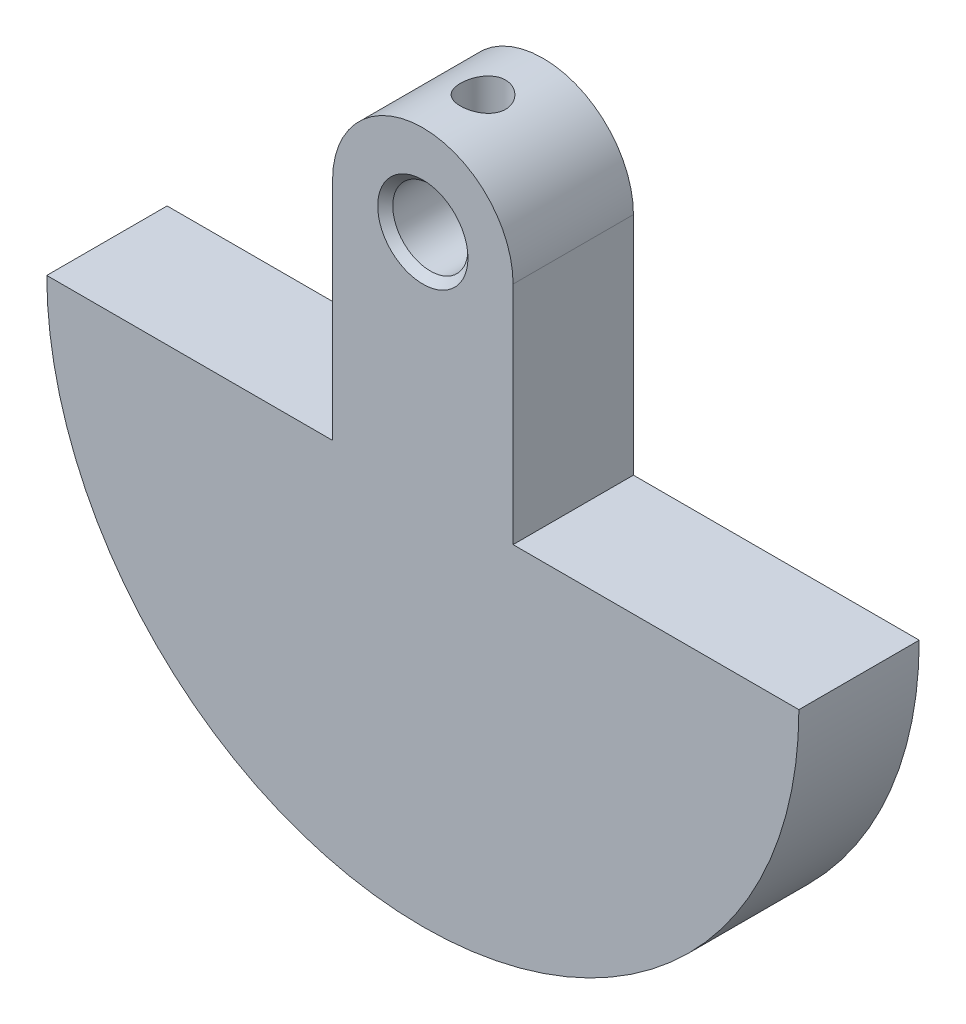
ISO-10303-21;
HEADER;
FILE_DESCRIPTION(('STEP AP214'),'2;1');
FILE_NAME('part.step','',(''),(''),'','','');
FILE_SCHEMA(('AUTOMOTIVE_DESIGN { 1 0 10303 214 1 1 1 1 }'));
ENDSEC;
DATA;
#1=APPLICATION_CONTEXT('core data for automotive mechanical design processes');
#2=APPLICATION_PROTOCOL_DEFINITION('international standard','automotive_design',2000,#1);
#3=PRODUCT_CONTEXT('',#1,'mechanical');
#4=PRODUCT('Part','Part','',(#3));
#5=PRODUCT_RELATED_PRODUCT_CATEGORY('part','',(#4));
#6=PRODUCT_DEFINITION_FORMATION('','',#4);
#7=PRODUCT_DEFINITION_CONTEXT('part definition',#1,'design');
#8=PRODUCT_DEFINITION('design','',#6,#7);
#9=PRODUCT_DEFINITION_SHAPE('','',#8);
#10=(LENGTH_UNIT() NAMED_UNIT(*) SI_UNIT(.MILLI.,.METRE.));
#11=(NAMED_UNIT(*) PLANE_ANGLE_UNIT() SI_UNIT($,.RADIAN.));
#12=(NAMED_UNIT(*) SI_UNIT($,.STERADIAN.) SOLID_ANGLE_UNIT());
#13=UNCERTAINTY_MEASURE_WITH_UNIT(LENGTH_MEASURE(1.E-05),#10,'distance_accuracy_value','');
#14=(GEOMETRIC_REPRESENTATION_CONTEXT(3) GLOBAL_UNCERTAINTY_ASSIGNED_CONTEXT((#13)) GLOBAL_UNIT_ASSIGNED_CONTEXT((#10,
#11,#12)) REPRESENTATION_CONTEXT('',''));
#15=CARTESIAN_POINT('',(0.,0.,0.));
#16=DIRECTION('',(0.,0.,1.));
#17=DIRECTION('',(1.,0.,0.));
#18=AXIS2_PLACEMENT_3D('',#15,#16,#17);
#19=CARTESIAN_POINT('',(0.,15.,8.));
#20=DIRECTION('',(0.,0.,1.));
#21=DIRECTION('',(1.,0.,0.));
#22=AXIS2_PLACEMENT_3D('',#19,#20,#21);
#23=PLANE('',#22);
#24=CARTESIAN_POINT('',(0.,15.,8.));
#25=DIRECTION('',(0.,0.,1.));
#26=DIRECTION('',(1.,0.,0.));
#27=AXIS2_PLACEMENT_3D('',#24,#25,#26);
#28=CIRCLE('',#27,3.);
#29=CARTESIAN_POINT('',(3.,15.,8.));
#30=VERTEX_POINT('',#29);
#31=EDGE_CURVE('E11',#30,#30,#28,.F.);
#32=ORIENTED_EDGE('',*,*,#31,.T.);
#33=EDGE_LOOP('',(#32));
#34=FACE_BOUND('',#33,.T.);
#35=CARTESIAN_POINT('',(0.,15.,8.));
#36=DIRECTION('',(0.,0.,1.));
#37=DIRECTION('',(1.,0.,0.));
#38=AXIS2_PLACEMENT_3D('',#35,#36,#37);
#39=CIRCLE('',#38,6.);
#40=CARTESIAN_POINT('',(6.,15.,8.));
#41=VERTEX_POINT('',#40);
#42=CARTESIAN_POINT('',(-6.,15.,8.));
#43=VERTEX_POINT('',#42);
#44=EDGE_CURVE('E138',#41,#43,#39,.T.);
#45=ORIENTED_EDGE('',*,*,#44,.T.);
#46=DIRECTION('',(0.,-1.,0.));
#47=VECTOR('',#46,1.);
#48=CARTESIAN_POINT('',(-6.,15.,8.));
#49=LINE('',#48,#47);
#50=CARTESIAN_POINT('',(-6.,0.,8.));
#51=VERTEX_POINT('',#50);
#52=EDGE_CURVE('E97',#43,#51,#49,.T.);
#53=ORIENTED_EDGE('',*,*,#52,.T.);
#54=DIRECTION('',(-1.,0.,0.));
#55=VECTOR('',#54,1.);
#56=CARTESIAN_POINT('',(-6.,0.,8.));
#57=LINE('',#56,#55);
#58=CARTESIAN_POINT('',(-25.,0.,8.));
#59=VERTEX_POINT('',#58);
#60=EDGE_CURVE('E109',#51,#59,#57,.T.);
#61=ORIENTED_EDGE('',*,*,#60,.T.);
#62=CARTESIAN_POINT('',(0.,0.,8.));
#63=DIRECTION('',(0.,0.,1.));
#64=DIRECTION('',(1.,0.,0.));
#65=AXIS2_PLACEMENT_3D('',#62,#63,#64);
#66=CIRCLE('',#65,25.);
#67=CARTESIAN_POINT('',(25.,0.,8.));
#68=VERTEX_POINT('',#67);
#69=EDGE_CURVE('E104',#59,#68,#66,.T.);
#70=ORIENTED_EDGE('',*,*,#69,.T.);
#71=DIRECTION('',(-1.,0.,0.));
#72=VECTOR('',#71,1.);
#73=CARTESIAN_POINT('',(6.,0.,8.));
#74=LINE('',#73,#72);
#75=CARTESIAN_POINT('',(6.,0.,8.));
#76=VERTEX_POINT('',#75);
#77=EDGE_CURVE('E107',#68,#76,#74,.T.);
#78=ORIENTED_EDGE('',*,*,#77,.T.);
#79=DIRECTION('',(0.,1.,0.));
#80=VECTOR('',#79,1.);
#81=CARTESIAN_POINT('',(6.,15.,8.));
#82=LINE('',#81,#80);
#83=EDGE_CURVE('E59',#76,#41,#82,.T.);
#84=ORIENTED_EDGE('',*,*,#83,.T.);
#85=EDGE_LOOP('',(#45,#53,#61,#70,#78,#84));
#86=FACE_BOUND('',#85,.T.);
#87=ADVANCED_FACE('F35',(#34,#86),#23,.T.);
#88=CARTESIAN_POINT('',(0.,15.,0.));
#89=DIRECTION('',(0.,0.,1.));
#90=DIRECTION('',(1.,0.,0.));
#91=AXIS2_PLACEMENT_3D('',#88,#89,#90);
#92=PLANE('',#91);
#93=CARTESIAN_POINT('',(0.,15.,0.));
#94=DIRECTION('',(0.,0.,1.));
#95=DIRECTION('',(1.,0.,0.));
#96=AXIS2_PLACEMENT_3D('',#93,#94,#95);
#97=CIRCLE('',#96,6.);
#98=CARTESIAN_POINT('',(6.,15.,0.));
#99=VERTEX_POINT('',#98);
#100=CARTESIAN_POINT('',(-6.,15.,0.));
#101=VERTEX_POINT('',#100);
#102=EDGE_CURVE('E127',#99,#101,#97,.T.);
#103=ORIENTED_EDGE('',*,*,#102,.F.);
#104=DIRECTION('',(0.,1.,0.));
#105=VECTOR('',#104,1.);
#106=CARTESIAN_POINT('',(6.,15.,0.));
#107=LINE('',#106,#105);
#108=CARTESIAN_POINT('',(6.,0.,0.));
#109=VERTEX_POINT('',#108);
#110=EDGE_CURVE('E88',#109,#99,#107,.T.);
#111=ORIENTED_EDGE('',*,*,#110,.F.);
#112=DIRECTION('',(-1.,0.,0.));
#113=VECTOR('',#112,1.);
#114=CARTESIAN_POINT('',(6.,0.,0.));
#115=LINE('',#114,#113);
#116=CARTESIAN_POINT('',(25.,0.,0.));
#117=VERTEX_POINT('',#116);
#118=EDGE_CURVE('E82',#117,#109,#115,.T.);
#119=ORIENTED_EDGE('',*,*,#118,.F.);
#120=CARTESIAN_POINT('',(0.,0.,0.));
#121=DIRECTION('',(0.,0.,1.));
#122=DIRECTION('',(1.,0.,0.));
#123=AXIS2_PLACEMENT_3D('',#120,#121,#122);
#124=CIRCLE('',#123,25.);
#125=CARTESIAN_POINT('',(-25.,0.,0.));
#126=VERTEX_POINT('',#125);
#127=EDGE_CURVE('E117',#126,#117,#124,.T.);
#128=ORIENTED_EDGE('',*,*,#127,.F.);
#129=DIRECTION('',(-1.,0.,0.));
#130=VECTOR('',#129,1.);
#131=CARTESIAN_POINT('',(-6.,0.,0.));
#132=LINE('',#131,#130);
#133=CARTESIAN_POINT('',(-6.,0.,0.));
#134=VERTEX_POINT('',#133);
#135=EDGE_CURVE('E133',#134,#126,#132,.T.);
#136=ORIENTED_EDGE('',*,*,#135,.F.);
#137=DIRECTION('',(0.,-1.,0.));
#138=VECTOR('',#137,1.);
#139=CARTESIAN_POINT('',(-6.,15.,0.));
#140=LINE('',#139,#138);
#141=EDGE_CURVE('E130',#101,#134,#140,.T.);
#142=ORIENTED_EDGE('',*,*,#141,.F.);
#143=EDGE_LOOP('',(#103,#111,#119,#128,#136,#142));
#144=FACE_BOUND('',#143,.T.);
#145=CARTESIAN_POINT('',(0.,15.,0.));
#146=DIRECTION('',(0.,0.,1.));
#147=DIRECTION('',(1.,0.,0.));
#148=AXIS2_PLACEMENT_3D('',#145,#146,#147);
#149=CIRCLE('',#148,2.5);
#150=CARTESIAN_POINT('',(2.5,15.,0.));
#151=VERTEX_POINT('',#150);
#152=EDGE_CURVE('E131',#151,#151,#149,.T.);
#153=ORIENTED_EDGE('',*,*,#152,.T.);
#154=EDGE_LOOP('',(#153));
#155=FACE_BOUND('',#154,.T.);
#156=ADVANCED_FACE('F165',(#144,#155),#92,.F.);
#157=CARTESIAN_POINT('',(0.,15.,8.));
#158=DIRECTION('',(0.,0.,-1.));
#159=DIRECTION('',(-1.,0.,0.));
#160=AXIS2_PLACEMENT_3D('',#157,#158,#159);
#161=CYLINDRICAL_SURFACE('',#160,6.);
#162=CARTESIAN_POINT('',(0.,21.,5.5));
#163=CARTESIAN_POINT('',(-0.0828760886697311,20.9999985986801,5.49999767426184));
#164=CARTESIAN_POINT('',(-0.165778157830763,20.9982657813183,5.49310844922621));
#165=CARTESIAN_POINT('',(-0.329206323770533,20.9915211382989,5.465774848693));
#166=CARTESIAN_POINT('',(-0.409731046870739,20.9865074541997,5.44532279046215));
#167=CARTESIAN_POINT('',(-0.566020872182577,20.9737562633204,5.39156074653791));
#168=CARTESIAN_POINT('',(-0.641791563430003,20.9660220284209,5.35826620128472));
#169=CARTESIAN_POINT('',(-0.786672131904427,20.9486534380759,5.27981860995517));
#170=CARTESIAN_POINT('',(-0.855781784348759,20.9390190185405,5.23466516388106));
#171=CARTESIAN_POINT('',(-0.98680192730092,20.918674135918,5.13279921034579));
#172=CARTESIAN_POINT('',(-1.04855569006107,20.9079470714853,5.07588842504082));
#173=CARTESIAN_POINT('',(-1.1617489272033,20.8867362011753,4.95254779509108));
#174=CARTESIAN_POINT('',(-1.21318723694913,20.8762524228835,4.8861168770535));
#175=CARTESIAN_POINT('',(-1.30502654279903,20.8565477569971,4.74440477326256));
#176=CARTESIAN_POINT('',(-1.34525221592536,20.847347944706,4.6690067691896));
#177=CARTESIAN_POINT('',(-1.41239690855053,20.8314949481222,4.51225158834164));
#178=CARTESIAN_POINT('',(-1.43931805543933,20.8248413567279,4.43089536667424));
#179=CARTESIAN_POINT('',(-1.47855483680429,20.8150047671755,4.26625650179753));
#180=CARTESIAN_POINT('',(-1.49115226833334,20.8117549107543,4.1830451039502));
#181=CARTESIAN_POINT('',(-1.50226177506785,20.8088936253774,4.01563143098602));
#182=CARTESIAN_POINT('',(-1.50077614181798,20.8092816044864,3.93142931930139));
#183=CARTESIAN_POINT('',(-1.48398652463928,20.8135920549662,3.76658419225552));
#184=CARTESIAN_POINT('',(-1.46901834019052,20.8174286300188,3.6859043785349));
#185=CARTESIAN_POINT('',(-1.42622418690311,20.8280670967648,3.52823894908871));
#186=CARTESIAN_POINT('',(-1.39839730206942,20.834869199707,3.45125359697102));
#187=CARTESIAN_POINT('',(-1.33038947793715,20.8507511390419,3.30226198374793));
#188=CARTESIAN_POINT('',(-1.29008666723291,20.8598532746942,3.23031382821045));
#189=CARTESIAN_POINT('',(-1.19835627601495,20.8792971084639,3.09408129024316));
#190=CARTESIAN_POINT('',(-1.14692674880884,20.8896390233474,3.02979825193274));
#191=CARTESIAN_POINT('',(-1.03266342468122,20.9107588053978,2.9087963843056));
#192=CARTESIAN_POINT('',(-0.969546258165859,20.9215406947797,2.85234550993865));
#193=CARTESIAN_POINT('',(-0.834611917503699,20.9420596557879,2.7507787575361));
#194=CARTESIAN_POINT('',(-0.762794477707943,20.9517966954942,2.70566322573643));
#195=CARTESIAN_POINT('',(-0.612115888681391,20.9691773209418,2.62794941377561));
#196=CARTESIAN_POINT('',(-0.533231393208623,20.9768136012773,2.59539465974557));
#197=CARTESIAN_POINT('',(-0.370876008142883,20.9890791699142,2.54408269429043));
#198=CARTESIAN_POINT('',(-0.287405999150485,20.9937090333928,2.52532284358186));
#199=CARTESIAN_POINT('',(-0.120539970390027,20.9993549927137,2.50254243444116));
#200=CARTESIAN_POINT('',(-0.0371967199882101,21.0004605350828,2.4981569739247));
#201=CARTESIAN_POINT('',(0.129032874801508,20.9991880481445,2.50324900205549));
#202=CARTESIAN_POINT('',(0.211919259644595,20.9968103324185,2.51272524279913));
#203=CARTESIAN_POINT('',(0.373614268776492,20.9888958112736,2.54497090839138));
#204=CARTESIAN_POINT('',(0.452465118968754,20.9834063418581,2.56754126347699));
#205=CARTESIAN_POINT('',(0.605257292452511,20.9698870663413,2.62510708402845));
#206=CARTESIAN_POINT('',(0.679198119032635,20.9618570036989,2.66010380431317));
#207=CARTESIAN_POINT('',(0.821523134429847,20.9439330792631,2.74223612887473));
#208=CARTESIAN_POINT('',(0.88978544183583,20.9340086736693,2.78957611239676));
#209=CARTESIAN_POINT('',(1.01752661364325,20.9134450918742,2.89478990879697));
#210=CARTESIAN_POINT('',(1.07700395897301,20.9028057925171,2.95266553961691));
#211=CARTESIAN_POINT('',(1.18699056807273,20.8816895696077,3.07900196084446));
#212=CARTESIAN_POINT('',(1.23724386762203,20.8712230418728,3.14768770300242));
#213=CARTESIAN_POINT('',(1.3255107590127,20.8519287837724,3.29273263446572));
#214=CARTESIAN_POINT('',(1.36352489415794,20.8431009806703,3.36909148295975));
#215=CARTESIAN_POINT('',(1.42595142060929,20.8281809473467,3.52690572241308));
#216=CARTESIAN_POINT('',(1.45044439665406,20.8220725529191,3.60832762834401));
#217=CARTESIAN_POINT('',(1.48534565995378,20.8132674409018,3.77430963788911));
#218=CARTESIAN_POINT('',(1.49575702747866,20.8105699771994,3.85886905103249));
#219=CARTESIAN_POINT('',(1.50203859033399,20.8089490120396,4.0261210238552));
#220=CARTESIAN_POINT('',(1.49831789778012,20.8099193272826,4.10879743512473));
#221=CARTESIAN_POINT('',(1.47737727831287,20.8152790900784,4.27230388866798));
#222=CARTESIAN_POINT('',(1.46015762268677,20.8196684689186,4.35313396801365));
#223=CARTESIAN_POINT('',(1.41293131944279,20.8313126068272,4.51020845906541));
#224=CARTESIAN_POINT('',(1.38300140468038,20.8385501523631,4.58647730524021));
#225=CARTESIAN_POINT('',(1.31126491360507,20.8550775572483,4.73296538271369));
#226=CARTESIAN_POINT('',(1.26945669003419,20.8643677012077,4.80318377318692));
#227=CARTESIAN_POINT('',(1.17386774863714,20.8842563426351,4.93755462900202));
#228=CARTESIAN_POINT('',(1.11980316291225,20.8948826483176,5.00150107342396));
#229=CARTESIAN_POINT('',(1.00178937118974,20.9160802724629,5.11954704479541));
#230=CARTESIAN_POINT('',(0.937837821261145,20.9266515772706,5.17364423011297));
#231=CARTESIAN_POINT('',(0.80046758670259,20.9467765564766,5.27141130856461));
#232=CARTESIAN_POINT('',(0.726898422316386,20.9563083336587,5.31487461367158));
#233=CARTESIAN_POINT('',(0.573266059510476,20.9730492497512,5.38874746294053));
#234=CARTESIAN_POINT('',(0.493207563436739,20.9802600519978,5.41916636064854));
#235=CARTESIAN_POINT('',(0.344410253243472,20.9904805956554,5.46157183032965));
#236=CARTESIAN_POINT('',(0.276380170908068,20.9940258505269,5.47595124305343));
#237=CARTESIAN_POINT('',(0.138906071536283,20.9987860523195,5.49516594362194));
#238=CARTESIAN_POINT('',(0.0694621612426162,21.0000011745089,5.5000019493053));
#239=CARTESIAN_POINT('',(0.,21.,5.5));
#240=B_SPLINE_CURVE_WITH_KNOTS('',3,(#162,#163,#164,#165,#166,#167,#168,#169,#170,#171,#172,
#173,#174,#175,#176,#177,#178,#179,#180,#181,#182,#183,#184,#185,#186,#187,#188,#189,#190,#191,
#192,#193,#194,#195,#196,#197,#198,#199,#200,#201,#202,#203,#204,#205,#206,#207,#208,#209,#210,
#211,#212,#213,#214,#215,#216,#217,#218,#219,#220,#221,#222,#223,#224,#225,#226,#227,#228,#229,
#230,#231,#232,#233,#234,#235,#236,#237,#238,#239),.UNSPECIFIED.,.T.,.F.,(4,2,2,2,2,2,2,2,2,2,2,
2,2,2,2,2,2,2,2,2,2,2,2,2,2,2,2,2,2,2,2,2,2,2,2,2,2,2,4),(0.,0.24837371247189,0.4968882377639,
0.745104902286106,0.993329940169328,1.24614435437139,1.49898729580062,1.75558647545807,
2.01214461169368,2.2635629509943,2.51494038112697,2.76022497007018,3.00552703466038,
3.25330527873879,3.50112690836163,3.75601500969019,4.01091089558247,4.26668229009114,
4.52240473688643,4.77158308949276,5.02073901112743,5.26620274514037,5.5116912732229,
5.76153587565352,6.01142363008019,6.26744509204476,6.52345518749508,6.77792254614036,
7.03233423252408,7.27943780398613,7.52653640956034,7.77216400559447,8.01782568136901,
8.2698957640991,8.52202569770418,8.77872185499588,9.0352336382135,9.24342242942149,
9.4515955604304),.UNSPECIFIED.);
#241=CARTESIAN_POINT('',(0.,21.,5.5));
#242=VERTEX_POINT('',#241);
#243=EDGE_CURVE('E192',#242,#242,#240,.T.);
#244=ORIENTED_EDGE('',*,*,#243,.T.);
#245=EDGE_LOOP('',(#244));
#246=FACE_BOUND('',#245,.T.);
#247=ORIENTED_EDGE('',*,*,#102,.T.);
#248=DIRECTION('',(0.,0.,-1.));
#249=VECTOR('',#248,1.);
#250=CARTESIAN_POINT('',(-6.,15.,8.));
#251=LINE('',#250,#249);
#252=EDGE_CURVE('E145',#43,#101,#251,.T.);
#253=ORIENTED_EDGE('',*,*,#252,.F.);
#254=ORIENTED_EDGE('',*,*,#44,.F.);
#255=DIRECTION('',(0.,0.,-1.));
#256=VECTOR('',#255,1.);
#257=CARTESIAN_POINT('',(6.,15.,8.));
#258=LINE('',#257,#256);
#259=EDGE_CURVE('E123',#41,#99,#258,.T.);
#260=ORIENTED_EDGE('',*,*,#259,.T.);
#261=EDGE_LOOP('',(#247,#253,#254,#260));
#262=FACE_BOUND('',#261,.T.);
#263=ADVANCED_FACE('F171',(#246,#262),#161,.T.);
#264=CARTESIAN_POINT('',(-6.,15.,8.));
#265=DIRECTION('',(1.,0.,0.));
#266=DIRECTION('',(0.,0.,-1.));
#267=AXIS2_PLACEMENT_3D('',#264,#265,#266);
#268=PLANE('',#267);
#269=ORIENTED_EDGE('',*,*,#141,.T.);
#270=DIRECTION('',(0.,0.,-1.));
#271=VECTOR('',#270,1.);
#272=CARTESIAN_POINT('',(-6.,0.,8.));
#273=LINE('',#272,#271);
#274=EDGE_CURVE('E142',#51,#134,#273,.T.);
#275=ORIENTED_EDGE('',*,*,#274,.F.);
#276=ORIENTED_EDGE('',*,*,#52,.F.);
#277=ORIENTED_EDGE('',*,*,#252,.T.);
#278=EDGE_LOOP('',(#269,#275,#276,#277));
#279=FACE_BOUND('',#278,.T.);
#280=ADVANCED_FACE('F185',(#279),#268,.F.);
#281=CARTESIAN_POINT('',(-6.,0.,8.));
#282=DIRECTION('',(0.,-1.,0.));
#283=DIRECTION('',(0.,0.,-1.));
#284=AXIS2_PLACEMENT_3D('',#281,#282,#283);
#285=PLANE('',#284);
#286=ORIENTED_EDGE('',*,*,#135,.T.);
#287=DIRECTION('',(0.,0.,-1.));
#288=VECTOR('',#287,1.);
#289=CARTESIAN_POINT('',(-25.,0.,8.));
#290=LINE('',#289,#288);
#291=EDGE_CURVE('E118',#59,#126,#290,.T.);
#292=ORIENTED_EDGE('',*,*,#291,.F.);
#293=ORIENTED_EDGE('',*,*,#60,.F.);
#294=ORIENTED_EDGE('',*,*,#274,.T.);
#295=EDGE_LOOP('',(#286,#292,#293,#294));
#296=FACE_BOUND('',#295,.T.);
#297=ADVANCED_FACE('F182',(#296),#285,.F.);
#298=CARTESIAN_POINT('',(0.,0.,8.));
#299=DIRECTION('',(0.,0.,-1.));
#300=DIRECTION('',(-1.,0.,0.));
#301=AXIS2_PLACEMENT_3D('',#298,#299,#300);
#302=CYLINDRICAL_SURFACE('',#301,25.);
#303=ORIENTED_EDGE('',*,*,#127,.T.);
#304=DIRECTION('',(0.,0.,-1.));
#305=VECTOR('',#304,1.);
#306=CARTESIAN_POINT('',(25.,0.,8.));
#307=LINE('',#306,#305);
#308=EDGE_CURVE('E114',#68,#117,#307,.T.);
#309=ORIENTED_EDGE('',*,*,#308,.F.);
#310=ORIENTED_EDGE('',*,*,#69,.F.);
#311=ORIENTED_EDGE('',*,*,#291,.T.);
#312=EDGE_LOOP('',(#303,#309,#310,#311));
#313=FACE_BOUND('',#312,.T.);
#314=ADVANCED_FACE('F115',(#313),#302,.T.);
#315=CARTESIAN_POINT('',(6.,0.,8.));
#316=DIRECTION('',(0.,-1.,0.));
#317=DIRECTION('',(0.,0.,-1.));
#318=AXIS2_PLACEMENT_3D('',#315,#316,#317);
#319=PLANE('',#318);
#320=ORIENTED_EDGE('',*,*,#118,.T.);
#321=DIRECTION('',(0.,0.,-1.));
#322=VECTOR('',#321,1.);
#323=CARTESIAN_POINT('',(6.,0.,8.));
#324=LINE('',#323,#322);
#325=EDGE_CURVE('E119',#76,#109,#324,.T.);
#326=ORIENTED_EDGE('',*,*,#325,.F.);
#327=ORIENTED_EDGE('',*,*,#77,.F.);
#328=ORIENTED_EDGE('',*,*,#308,.T.);
#329=EDGE_LOOP('',(#320,#326,#327,#328));
#330=FACE_BOUND('',#329,.T.);
#331=ADVANCED_FACE('F121',(#330),#319,.F.);
#332=CARTESIAN_POINT('',(6.,15.,8.));
#333=DIRECTION('',(-1.,0.,0.));
#334=DIRECTION('',(0.,0.,1.));
#335=AXIS2_PLACEMENT_3D('',#332,#333,#334);
#336=PLANE('',#335);
#337=ORIENTED_EDGE('',*,*,#110,.T.);
#338=ORIENTED_EDGE('',*,*,#259,.F.);
#339=ORIENTED_EDGE('',*,*,#83,.F.);
#340=ORIENTED_EDGE('',*,*,#325,.T.);
#341=EDGE_LOOP('',(#337,#338,#339,#340));
#342=FACE_BOUND('',#341,.T.);
#343=ADVANCED_FACE('F161',(#342),#336,.F.);
#344=CARTESIAN_POINT('',(0.,15.,8.));
#345=DIRECTION('',(0.,0.,-1.));
#346=DIRECTION('',(-1.,0.,0.));
#347=AXIS2_PLACEMENT_3D('',#344,#345,#346);
#348=CYLINDRICAL_SURFACE('',#347,2.5);
#349=CARTESIAN_POINT('',(0.,17.5,5.5));
#350=CARTESIAN_POINT('',(-0.0767298334620159,17.4999962578973,5.49999590899012));
#351=CARTESIAN_POINT('',(-0.153582320644178,17.4964290461501,5.49407132907374));
#352=CARTESIAN_POINT('',(-0.304975509530679,17.4824990360857,5.47067568048467));
#353=CARTESIAN_POINT('',(-0.379510034596047,17.4721194803272,5.45317613814577));
#354=CARTESIAN_POINT('',(-0.523751827790836,17.4456155805449,5.40761363883314));
#355=CARTESIAN_POINT('',(-0.593481028226566,17.4295197327294,5.37960304183684));
#356=CARTESIAN_POINT('',(-0.727030318214659,17.3929536762641,5.31413966685897));
#357=CARTESIAN_POINT('',(-0.790851869416383,17.3724845538025,5.27668923303125));
#358=CARTESIAN_POINT('',(-0.916299278999315,17.3270536071909,5.19022517329142));
#359=CARTESIAN_POINT('',(-0.977384020081415,17.3018679219598,5.14054630464861));
#360=CARTESIAN_POINT('',(-1.09088270411891,17.2503043927963,5.03253279617173));
#361=CARTESIAN_POINT('',(-1.14328534948112,17.2239250515357,4.97418706281268));
#362=CARTESIAN_POINT('',(-1.24444996762974,17.1691106699591,4.84207648950327));
#363=CARTESIAN_POINT('',(-1.29197766378809,17.1408201770365,4.76729822901871));
#364=CARTESIAN_POINT('',(-1.37361437764896,17.0893830141212,4.60915342675688));
#365=CARTESIAN_POINT('',(-1.4077451733516,17.0662280227394,4.52580110375243));
#366=CARTESIAN_POINT('',(-1.45440601714222,17.0335462966093,4.37340354934676));
#367=CARTESIAN_POINT('',(-1.47016197246826,17.0220788313759,4.30576400138968));
#368=CARTESIAN_POINT('',(-1.49216172340475,17.005903082955,4.16819628416964));
#369=CARTESIAN_POINT('',(-1.49841734556836,17.0011863964376,4.09827107124551));
#370=CARTESIAN_POINT('',(-1.50105508796009,16.9992092246386,3.95798850578266));
#371=CARTESIAN_POINT('',(-1.49741783408419,17.0019633701272,3.8876305749068));
#372=CARTESIAN_POINT('',(-1.48046060478828,17.0145326144374,3.74872122457241));
#373=CARTESIAN_POINT('',(-1.46713334620103,17.0243530243223,3.68017120415256));
#374=CARTESIAN_POINT('',(-1.43173921881792,17.0495318694426,3.54746975787189));
#375=CARTESIAN_POINT('',(-1.40978748666087,17.0648171165254,3.48327294607552));
#376=CARTESIAN_POINT('',(-1.35795061770837,17.0992705135083,3.35930500907188));
#377=CARTESIAN_POINT('',(-1.32806257259705,17.1184400862346,3.29953551657607));
#378=CARTESIAN_POINT('',(-1.25517983184583,17.1625532726899,3.1750159028772));
#379=CARTESIAN_POINT('',(-1.21080724397723,17.1879204337299,3.11122190704507));
#380=CARTESIAN_POINT('',(-1.11291092784003,17.2393059976438,2.99132351633298));
#381=CARTESIAN_POINT('',(-1.05937845100578,17.2653250026215,2.93522656602349));
#382=CARTESIAN_POINT('',(-0.935811834382966,17.3193550495832,2.82438701817824));
#383=CARTESIAN_POINT('',(-0.864517682704956,17.3471383626853,2.77092269398401));
#384=CARTESIAN_POINT('',(-0.712276050458999,17.3977242843398,2.67687795280209));
#385=CARTESIAN_POINT('',(-0.631333763943563,17.4205295542552,2.63629064621005));
#386=CARTESIAN_POINT('',(-0.467197585268205,17.4573039206615,2.5720678172041));
#387=CARTESIAN_POINT('',(-0.384467624173579,17.471739574397,2.54752464428409));
#388=CARTESIAN_POINT('',(-0.215047895144638,17.4921884281355,2.51298880259462));
#389=CARTESIAN_POINT('',(-0.128363005661317,17.4982117295274,2.50297868224642));
#390=CARTESIAN_POINT('',(0.0337146143773981,17.5009057037461,2.49849215232169));
#391=CARTESIAN_POINT('',(0.109042473418719,17.4987352171429,2.50209114491483));
#392=CARTESIAN_POINT('',(0.257829401986062,17.4877871208705,2.52042585307192));
#393=CARTESIAN_POINT('',(0.331288509376107,17.4790096451804,2.53516134280581));
#394=CARTESIAN_POINT('',(0.472574932157614,17.4559479244219,2.57454343281246));
#395=CARTESIAN_POINT('',(0.540495750928485,17.4418027566255,2.59894034907347));
#396=CARTESIAN_POINT('',(0.671265749087264,17.4091388086284,2.65667737636527));
#397=CARTESIAN_POINT('',(0.73411392496391,17.3906191658651,2.69001925134667));
#398=CARTESIAN_POINT('',(0.860006262823866,17.3484549623736,2.76855697920871));
#399=CARTESIAN_POINT('',(0.922394150456839,17.3244780273988,2.8146238290784));
#400=CARTESIAN_POINT('',(1.03902603131014,17.2747426557473,2.91539139348862));
#401=CARTESIAN_POINT('',(1.09326040273738,17.2489821658636,2.97010215485254));
#402=CARTESIAN_POINT('',(1.19931996735579,17.1944542390989,3.09491039003715));
#403=CARTESIAN_POINT('',(1.24991019630915,17.1657324174629,3.16608388546551));
#404=CARTESIAN_POINT('',(1.33845238915668,17.1121618206671,3.31721602456821));
#405=CARTESIAN_POINT('',(1.37641766769781,17.0873089799769,3.39716529389279));
#406=CARTESIAN_POINT('',(1.43142578795776,17.0498490924052,3.54624302230669));
#407=CARTESIAN_POINT('',(1.4512162533619,17.0357565932873,3.61398031235859));
#408=CARTESIAN_POINT('',(1.48113663905972,17.0140960574354,3.75253207808011));
#409=CARTESIAN_POINT('',(1.49127995297631,17.0065189764272,3.82334214432783));
#410=CARTESIAN_POINT('',(1.50134130416631,16.9990044661627,3.96637694759703));
#411=CARTESIAN_POINT('',(1.50122089107869,16.9990957644594,4.03860599068704));
#412=CARTESIAN_POINT('',(1.49066472959328,17.0069771789285,4.18189443560946));
#413=CARTESIAN_POINT('',(1.48022337215759,17.0147714813882,4.2529531800806));
#414=CARTESIAN_POINT('',(1.45040174148913,17.0363318524298,4.38848841757219));
#415=CARTESIAN_POINT('',(1.43147636845351,17.0497921180558,4.45311709430687));
#416=CARTESIAN_POINT('',(1.38563242076993,17.0810550196015,4.57833725447422));
#417=CARTESIAN_POINT('',(1.35871083588479,17.0988592904048,4.63892720696056));
#418=CARTESIAN_POINT('',(1.29289245555732,17.1401299055092,4.76431985722078));
#419=CARTESIAN_POINT('',(1.25279167675753,17.1640458758264,4.82834110385431));
#420=CARTESIAN_POINT('',(1.16375698389084,17.2132012703077,4.94938007261729));
#421=CARTESIAN_POINT('',(1.11481579607798,17.2384417720502,5.00639196215256));
#422=CARTESIAN_POINT('',(1.00009777425734,17.2922569029148,5.12135094913167));
#423=CARTESIAN_POINT('',(0.932876819313901,17.3207030866366,5.17793107489619));
#424=CARTESIAN_POINT('',(0.788462434445585,17.3736542887237,5.27909785586331));
#425=CARTESIAN_POINT('',(0.711265444501536,17.3981578931094,5.3236802119848));
#426=CARTESIAN_POINT('',(0.55112523080145,17.4398557865439,5.39778580757374));
#427=CARTESIAN_POINT('',(0.46843008695721,17.4572507747979,5.42772806492683));
#428=CARTESIAN_POINT('',(0.297973306118803,17.4836627300125,5.47272469521098));
#429=CARTESIAN_POINT('',(0.210232099648608,17.4927112587148,5.48783516785699));
#430=CARTESIAN_POINT('',(0.101558096917533,17.4980200116819,5.49669745470866));
#431=CARTESIAN_POINT('',(0.0812762590282742,17.4987611465636,5.4979344173061));
#432=CARTESIAN_POINT('',(0.0406658206871104,17.4997516451737,5.49958624637086));
#433=CARTESIAN_POINT('',(0.0203372186375685,17.5000009918432,5.5000010843209));
#434=CARTESIAN_POINT('',(0.,17.5,5.5));
#435=B_SPLINE_CURVE_WITH_KNOTS('',3,(#349,#350,#351,#352,#353,#354,#355,#356,#357,#358,#359,
#360,#361,#362,#363,#364,#365,#366,#367,#368,#369,#370,#371,#372,#373,#374,#375,#376,#377,#378,
#379,#380,#381,#382,#383,#384,#385,#386,#387,#388,#389,#390,#391,#392,#393,#394,#395,#396,#397,
#398,#399,#400,#401,#402,#403,#404,#405,#406,#407,#408,#409,#410,#411,#412,#413,#414,#415,#416,
#417,#418,#419,#420,#421,#422,#423,#424,#425,#426,#427,#428,#429,#430,#431,#432,#433,#434),
.UNSPECIFIED.,.T.,.F.,(4,2,2,2,2,2,2,2,2,2,2,2,2,2,2,2,2,2,2,2,2,2,2,2,2,2,2,2,2,2,2,2,2,2,2,2,
2,2,2,2,2,2,4),(0.,0.230102237548649,0.460772627520012,0.690308884600012,0.919788197992275,
1.16681590732472,1.41416257934801,1.69183813189807,1.96906040692092,2.17933829855633,
2.38935420916578,2.59978170870726,2.81036753273872,3.01823267593207,3.22617409809868,
3.47046995225163,3.71500044803674,3.99360957884691,4.27206939275324,4.53296790696559,
4.79355286918236,5.01875602722426,5.24395461863455,5.46367785689772,5.68344445659025,
5.92601365818362,6.16886690081836,6.44336762428009,6.71757792616456,6.93257787314692,
7.14727888733319,7.36278425777433,7.57840681155725,7.78364098331142,7.98895251523035,
8.22578610052286,8.46281544370208,8.73854311775519,9.01436946031985,9.28175654462677,
9.54812832184448,9.60911473335177,9.6701032602764),.UNSPECIFIED.);
#436=CARTESIAN_POINT('',(0.,17.5,5.5));
#437=VERTEX_POINT('',#436);
#438=EDGE_CURVE('E40',#437,#437,#435,.T.);
#439=ORIENTED_EDGE('',*,*,#438,.F.);
#440=EDGE_LOOP('',(#439));
#441=FACE_BOUND('',#440,.T.);
#442=CARTESIAN_POINT('',(0.,15.,7.5));
#443=DIRECTION('',(0.,0.,1.));
#444=DIRECTION('',(1.,0.,0.));
#445=AXIS2_PLACEMENT_3D('',#442,#443,#444);
#446=CIRCLE('',#445,2.5);
#447=CARTESIAN_POINT('',(2.5,15.,7.5));
#448=VERTEX_POINT('',#447);
#449=EDGE_CURVE('E51',#448,#448,#446,.T.);
#450=ORIENTED_EDGE('',*,*,#449,.T.);
#451=EDGE_LOOP('',(#450));
#452=FACE_BOUND('',#451,.T.);
#453=ORIENTED_EDGE('',*,*,#152,.F.);
#454=EDGE_LOOP('',(#453));
#455=FACE_BOUND('',#454,.T.);
#456=ADVANCED_FACE('F150',(#441,#452,#455),#348,.F.);
#457=CARTESIAN_POINT('',(0.,15.,7.5));
#458=DIRECTION('',(0.,0.,1.));
#459=DIRECTION('',(1.,0.,0.));
#460=AXIS2_PLACEMENT_3D('',#457,#458,#459);
#461=CONICAL_SURFACE('',#460,2.5,0.785398163397447);
#462=ORIENTED_EDGE('',*,*,#31,.F.);
#463=EDGE_LOOP('',(#462));
#464=FACE_BOUND('',#463,.T.);
#465=ORIENTED_EDGE('',*,*,#449,.F.);
#466=EDGE_LOOP('',(#465));
#467=FACE_BOUND('',#466,.T.);
#468=ADVANCED_FACE('F38',(#464,#467),#461,.F.);
#469=CARTESIAN_POINT('',(0.,16.,4.));
#470=DIRECTION('',(0.,1.,0.));
#471=DIRECTION('',(0.,0.,1.));
#472=AXIS2_PLACEMENT_3D('',#469,#470,#471);
#473=CYLINDRICAL_SURFACE('',#472,1.5);
#474=ORIENTED_EDGE('',*,*,#438,.T.);
#475=EDGE_LOOP('',(#474));
#476=FACE_BOUND('',#475,.T.);
#477=ORIENTED_EDGE('',*,*,#243,.F.);
#478=EDGE_LOOP('',(#477));
#479=FACE_BOUND('',#478,.T.);
#480=ADVANCED_FACE('F154',(#476,#479),#473,.F.);
#481=CLOSED_SHELL('',(#87,#156,#263,#280,#297,#314,#331,#343,#456,#468,#480));
#482=MANIFOLD_SOLID_BREP('B2',#481);
#483=ADVANCED_BREP_SHAPE_REPRESENTATION('',(#18,#482),#14);
#484=SHAPE_DEFINITION_REPRESENTATION(#9,#483);
ENDSEC;
END-ISO-10303-21;
